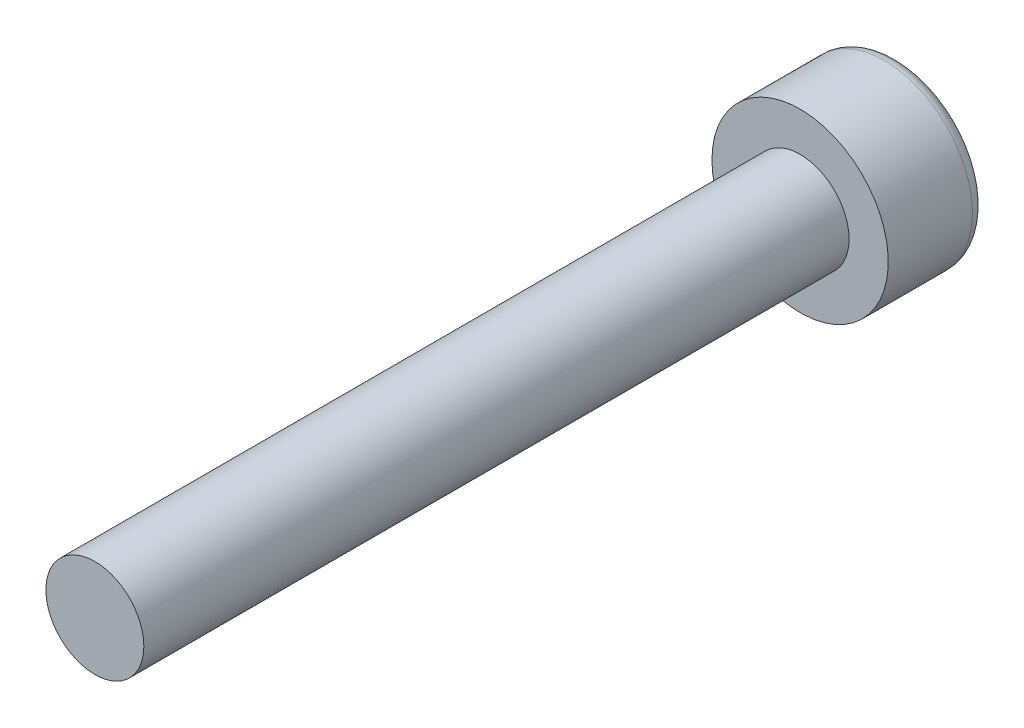
ISO-10303-21;
HEADER;
FILE_DESCRIPTION(('STEP AP214'),'2;1');
FILE_NAME('part.step','',(''),(''),'','','');
FILE_SCHEMA(('AUTOMOTIVE_DESIGN { 1 0 10303 214 1 1 1 1 }'));
ENDSEC;
DATA;
#1=APPLICATION_CONTEXT('core data for automotive mechanical design processes');
#2=APPLICATION_PROTOCOL_DEFINITION('international standard','automotive_design',2000,#1);
#3=PRODUCT_CONTEXT('',#1,'mechanical');
#4=PRODUCT('Part','Part','',(#3));
#5=PRODUCT_RELATED_PRODUCT_CATEGORY('part','',(#4));
#6=PRODUCT_DEFINITION_FORMATION('','',#4);
#7=PRODUCT_DEFINITION_CONTEXT('part definition',#1,'design');
#8=PRODUCT_DEFINITION('design','',#6,#7);
#9=PRODUCT_DEFINITION_SHAPE('','',#8);
#10=(LENGTH_UNIT() NAMED_UNIT(*) SI_UNIT(.MILLI.,.METRE.));
#11=(NAMED_UNIT(*) PLANE_ANGLE_UNIT() SI_UNIT($,.RADIAN.));
#12=(NAMED_UNIT(*) SI_UNIT($,.STERADIAN.) SOLID_ANGLE_UNIT());
#13=UNCERTAINTY_MEASURE_WITH_UNIT(LENGTH_MEASURE(1.E-05),#10,'distance_accuracy_value','');
#14=(GEOMETRIC_REPRESENTATION_CONTEXT(3) GLOBAL_UNCERTAINTY_ASSIGNED_CONTEXT((#13)) GLOBAL_UNIT_ASSIGNED_CONTEXT((#10,
#11,#12)) REPRESENTATION_CONTEXT('',''));
#15=CARTESIAN_POINT('',(0.,0.,0.));
#16=DIRECTION('',(0.,0.,1.));
#17=DIRECTION('',(1.,0.,0.));
#18=AXIS2_PLACEMENT_3D('',#15,#16,#17);
#19=CARTESIAN_POINT('',(0.,0.,18.));
#20=DIRECTION('',(0.,0.,-1.));
#21=DIRECTION('',(-1.,0.,0.));
#22=AXIS2_PLACEMENT_3D('',#19,#20,#21);
#23=CYLINDRICAL_SURFACE('',#22,1.25);
#24=CARTESIAN_POINT('',(0.,0.,18.));
#25=DIRECTION('',(0.,0.,1.));
#26=DIRECTION('',(1.,0.,0.));
#27=AXIS2_PLACEMENT_3D('',#24,#25,#26);
#28=CIRCLE('',#27,1.25);
#29=CARTESIAN_POINT('',(1.25,0.,18.));
#30=VERTEX_POINT('',#29);
#31=EDGE_CURVE('E144',#30,#30,#28,.T.);
#32=ORIENTED_EDGE('',*,*,#31,.F.);
#33=EDGE_LOOP('',(#32));
#34=FACE_BOUND('',#33,.T.);
#35=CARTESIAN_POINT('',(0.,0.,0.));
#36=DIRECTION('',(0.,0.,1.));
#37=DIRECTION('',(1.,0.,0.));
#38=AXIS2_PLACEMENT_3D('',#35,#36,#37);
#39=CIRCLE('',#38,1.25);
#40=CARTESIAN_POINT('',(1.25,0.,0.));
#41=VERTEX_POINT('',#40);
#42=EDGE_CURVE('E143',#41,#41,#39,.T.);
#43=ORIENTED_EDGE('',*,*,#42,.T.);
#44=EDGE_LOOP('',(#43));
#45=FACE_BOUND('',#44,.T.);
#46=ADVANCED_FACE('F33',(#34,#45),#23,.T.);
#47=CARTESIAN_POINT('',(0.,0.,18.));
#48=DIRECTION('',(0.,0.,1.));
#49=DIRECTION('',(1.,0.,0.));
#50=AXIS2_PLACEMENT_3D('',#47,#48,#49);
#51=PLANE('',#50);
#52=ORIENTED_EDGE('',*,*,#31,.T.);
#53=EDGE_LOOP('',(#52));
#54=FACE_BOUND('',#53,.T.);
#55=ADVANCED_FACE('F163',(#54),#51,.T.);
#56=CARTESIAN_POINT('',(0.,0.,-2.5));
#57=DIRECTION('',(0.,0.,1.));
#58=DIRECTION('',(1.,0.,0.));
#59=AXIS2_PLACEMENT_3D('',#56,#57,#58);
#60=CYLINDRICAL_SURFACE('',#59,2.25);
#61=CARTESIAN_POINT('',(0.,0.,-2.15));
#62=DIRECTION('',(0.,0.,-1.));
#63=DIRECTION('',(-1.,0.,0.));
#64=AXIS2_PLACEMENT_3D('',#61,#62,#63);
#65=CIRCLE('',#64,2.25);
#66=CARTESIAN_POINT('',(-2.25,0.,-2.15));
#67=VERTEX_POINT('',#66);
#68=EDGE_CURVE('E11',#67,#67,#65,.F.);
#69=ORIENTED_EDGE('',*,*,#68,.T.);
#70=EDGE_LOOP('',(#69));
#71=FACE_BOUND('',#70,.T.);
#72=CARTESIAN_POINT('',(0.,0.,0.));
#73=DIRECTION('',(0.,0.,-1.));
#74=DIRECTION('',(-1.,0.,0.));
#75=AXIS2_PLACEMENT_3D('',#72,#73,#74);
#76=CIRCLE('',#75,2.25);
#77=CARTESIAN_POINT('',(-2.25,0.,0.));
#78=VERTEX_POINT('',#77);
#79=EDGE_CURVE('E135',#78,#78,#76,.T.);
#80=ORIENTED_EDGE('',*,*,#79,.T.);
#81=EDGE_LOOP('',(#80));
#82=FACE_BOUND('',#81,.T.);
#83=ADVANCED_FACE('F168',(#71,#82),#60,.T.);
#84=CARTESIAN_POINT('',(0.,0.,-2.5));
#85=DIRECTION('',(0.,0.,-1.));
#86=DIRECTION('',(-1.,0.,0.));
#87=AXIS2_PLACEMENT_3D('',#84,#85,#86);
#88=PLANE('',#87);
#89=CARTESIAN_POINT('',(0.,0.,-2.5));
#90=DIRECTION('',(0.,0.,-1.));
#91=DIRECTION('',(-1.,0.,0.));
#92=AXIS2_PLACEMENT_3D('',#89,#90,#91);
#93=CIRCLE('',#92,1.9);
#94=CARTESIAN_POINT('',(-1.9,0.,-2.5));
#95=VERTEX_POINT('',#94);
#96=EDGE_CURVE('E41',#95,#95,#93,.T.);
#97=ORIENTED_EDGE('',*,*,#96,.T.);
#98=EDGE_LOOP('',(#97));
#99=FACE_BOUND('',#98,.T.);
#100=DIRECTION('',(-0.866025403784439,-0.5,0.));
#101=VECTOR('',#100,1.);
#102=CARTESIAN_POINT('',(1.,-0.577350269189626,-2.5));
#103=LINE('',#102,#101);
#104=CARTESIAN_POINT('',(1.,-0.577350269189626,-2.5));
#105=VERTEX_POINT('',#104);
#106=CARTESIAN_POINT('',(0.,-1.15470053837925,-2.5));
#107=VERTEX_POINT('',#106);
#108=EDGE_CURVE('E48',#105,#107,#103,.T.);
#109=ORIENTED_EDGE('',*,*,#108,.F.);
#110=DIRECTION('',(0.,-1.,0.));
#111=VECTOR('',#110,1.);
#112=CARTESIAN_POINT('',(1.,0.577350269189626,-2.5));
#113=LINE('',#112,#111);
#114=CARTESIAN_POINT('',(1.,0.577350269189626,-2.5));
#115=VERTEX_POINT('',#114);
#116=EDGE_CURVE('E131',#115,#105,#113,.T.);
#117=ORIENTED_EDGE('',*,*,#116,.F.);
#118=DIRECTION('',(0.866025403784439,-0.5,0.));
#119=VECTOR('',#118,1.);
#120=CARTESIAN_POINT('',(0.,1.15470053837925,-2.5));
#121=LINE('',#120,#119);
#122=CARTESIAN_POINT('',(0.,1.15470053837925,-2.5));
#123=VERTEX_POINT('',#122);
#124=EDGE_CURVE('E129',#123,#115,#121,.T.);
#125=ORIENTED_EDGE('',*,*,#124,.F.);
#126=DIRECTION('',(0.866025403784439,0.5,0.));
#127=VECTOR('',#126,1.);
#128=CARTESIAN_POINT('',(-1.,0.577350269189626,-2.5));
#129=LINE('',#128,#127);
#130=CARTESIAN_POINT('',(-1.,0.577350269189626,-2.5));
#131=VERTEX_POINT('',#130);
#132=EDGE_CURVE('E96',#131,#123,#129,.T.);
#133=ORIENTED_EDGE('',*,*,#132,.F.);
#134=DIRECTION('',(0.,1.,0.));
#135=VECTOR('',#134,1.);
#136=CARTESIAN_POINT('',(-1.,-0.577350269189626,-2.5));
#137=LINE('',#136,#135);
#138=CARTESIAN_POINT('',(-1.,-0.577350269189626,-2.5));
#139=VERTEX_POINT('',#138);
#140=EDGE_CURVE('E125',#139,#131,#137,.T.);
#141=ORIENTED_EDGE('',*,*,#140,.F.);
#142=DIRECTION('',(-0.866025403784438,0.5,0.));
#143=VECTOR('',#142,1.);
#144=CARTESIAN_POINT('',(0.,-1.15470053837925,-2.5));
#145=LINE('',#144,#143);
#146=EDGE_CURVE('E122',#107,#139,#145,.T.);
#147=ORIENTED_EDGE('',*,*,#146,.F.);
#148=EDGE_LOOP('',(#109,#117,#125,#133,#141,#147));
#149=FACE_BOUND('',#148,.T.);
#150=ADVANCED_FACE('F151',(#99,#149),#88,.T.);
#151=CARTESIAN_POINT('',(0.,0.,0.));
#152=DIRECTION('',(0.,0.,-1.));
#153=DIRECTION('',(-1.,0.,0.));
#154=AXIS2_PLACEMENT_3D('',#151,#152,#153);
#155=PLANE('',#154);
#156=ORIENTED_EDGE('',*,*,#42,.F.);
#157=EDGE_LOOP('',(#156));
#158=FACE_BOUND('',#157,.T.);
#159=ORIENTED_EDGE('',*,*,#79,.F.);
#160=EDGE_LOOP('',(#159));
#161=FACE_BOUND('',#160,.T.);
#162=ADVANCED_FACE('F177',(#158,#161),#155,.F.);
#163=CARTESIAN_POINT('',(1.,-0.577350269189626,-1.));
#164=DIRECTION('',(0.5,-0.866025403784438,0.));
#165=DIRECTION('',(0.866025403784439,0.5,0.));
#166=AXIS2_PLACEMENT_3D('',#163,#164,#165);
#167=PLANE('',#166);
#168=ORIENTED_EDGE('',*,*,#108,.T.);
#169=DIRECTION('',(0.,0.,-1.));
#170=VECTOR('',#169,1.);
#171=CARTESIAN_POINT('',(0.,-1.15470053837925,-1.));
#172=LINE('',#171,#170);
#173=CARTESIAN_POINT('',(0.,-1.15470053837925,-1.));
#174=VERTEX_POINT('',#173);
#175=EDGE_CURVE('E78',#174,#107,#172,.T.);
#176=ORIENTED_EDGE('',*,*,#175,.F.);
#177=DIRECTION('',(-0.866025403784439,-0.5,0.));
#178=VECTOR('',#177,1.);
#179=CARTESIAN_POINT('',(1.,-0.577350269189626,-1.));
#180=LINE('',#179,#178);
#181=CARTESIAN_POINT('',(1.,-0.577350269189626,-1.));
#182=VERTEX_POINT('',#181);
#183=EDGE_CURVE('E133',#182,#174,#180,.T.);
#184=ORIENTED_EDGE('',*,*,#183,.F.);
#185=DIRECTION('',(0.,0.,-1.));
#186=VECTOR('',#185,1.);
#187=CARTESIAN_POINT('',(1.,-0.577350269189626,-1.));
#188=LINE('',#187,#186);
#189=EDGE_CURVE('E56',#182,#105,#188,.T.);
#190=ORIENTED_EDGE('',*,*,#189,.T.);
#191=EDGE_LOOP('',(#168,#176,#184,#190));
#192=FACE_BOUND('',#191,.T.);
#193=ADVANCED_FACE('F180',(#192),#167,.F.);
#194=CARTESIAN_POINT('',(1.,0.577350269189626,-1.));
#195=DIRECTION('',(1.,0.,0.));
#196=DIRECTION('',(0.,1.,0.));
#197=AXIS2_PLACEMENT_3D('',#194,#195,#196);
#198=PLANE('',#197);
#199=ORIENTED_EDGE('',*,*,#116,.T.);
#200=ORIENTED_EDGE('',*,*,#189,.F.);
#201=DIRECTION('',(0.,-1.,0.));
#202=VECTOR('',#201,1.);
#203=CARTESIAN_POINT('',(1.,0.577350269189626,-1.));
#204=LINE('',#203,#202);
#205=CARTESIAN_POINT('',(1.,0.577350269189626,-1.));
#206=VERTEX_POINT('',#205);
#207=EDGE_CURVE('E108',#206,#182,#204,.T.);
#208=ORIENTED_EDGE('',*,*,#207,.F.);
#209=DIRECTION('',(0.,0.,-1.));
#210=VECTOR('',#209,1.);
#211=CARTESIAN_POINT('',(1.,0.577350269189626,-1.));
#212=LINE('',#211,#210);
#213=EDGE_CURVE('E100',#206,#115,#212,.T.);
#214=ORIENTED_EDGE('',*,*,#213,.T.);
#215=EDGE_LOOP('',(#199,#200,#208,#214));
#216=FACE_BOUND('',#215,.T.);
#217=ADVANCED_FACE('F186',(#216),#198,.F.);
#218=CARTESIAN_POINT('',(0.,1.15470053837925,-1.));
#219=DIRECTION('',(0.5,0.866025403784439,0.));
#220=DIRECTION('',(-0.866025403784439,0.5,0.));
#221=AXIS2_PLACEMENT_3D('',#218,#219,#220);
#222=PLANE('',#221);
#223=ORIENTED_EDGE('',*,*,#124,.T.);
#224=ORIENTED_EDGE('',*,*,#213,.F.);
#225=DIRECTION('',(0.866025403784439,-0.5,0.));
#226=VECTOR('',#225,1.);
#227=CARTESIAN_POINT('',(0.,1.15470053837925,-1.));
#228=LINE('',#227,#226);
#229=CARTESIAN_POINT('',(0.,1.15470053837925,-1.));
#230=VERTEX_POINT('',#229);
#231=EDGE_CURVE('E104',#230,#206,#228,.T.);
#232=ORIENTED_EDGE('',*,*,#231,.F.);
#233=DIRECTION('',(0.,0.,-1.));
#234=VECTOR('',#233,1.);
#235=CARTESIAN_POINT('',(0.,1.15470053837925,-1.));
#236=LINE('',#235,#234);
#237=EDGE_CURVE('E89',#230,#123,#236,.T.);
#238=ORIENTED_EDGE('',*,*,#237,.T.);
#239=EDGE_LOOP('',(#223,#224,#232,#238));
#240=FACE_BOUND('',#239,.T.);
#241=ADVANCED_FACE('F105',(#240),#222,.F.);
#242=CARTESIAN_POINT('',(-1.,0.577350269189626,-1.));
#243=DIRECTION('',(-0.5,0.866025403784439,0.));
#244=DIRECTION('',(-0.866025403784439,-0.5,0.));
#245=AXIS2_PLACEMENT_3D('',#242,#243,#244);
#246=PLANE('',#245);
#247=ORIENTED_EDGE('',*,*,#132,.T.);
#248=ORIENTED_EDGE('',*,*,#237,.F.);
#249=DIRECTION('',(0.866025403784439,0.5,0.));
#250=VECTOR('',#249,1.);
#251=CARTESIAN_POINT('',(-1.,0.577350269189626,-1.));
#252=LINE('',#251,#250);
#253=CARTESIAN_POINT('',(-1.,0.577350269189626,-1.));
#254=VERTEX_POINT('',#253);
#255=EDGE_CURVE('E93',#254,#230,#252,.T.);
#256=ORIENTED_EDGE('',*,*,#255,.F.);
#257=DIRECTION('',(0.,0.,-1.));
#258=VECTOR('',#257,1.);
#259=CARTESIAN_POINT('',(-1.,0.577350269189626,-1.));
#260=LINE('',#259,#258);
#261=EDGE_CURVE('E101',#254,#131,#260,.T.);
#262=ORIENTED_EDGE('',*,*,#261,.T.);
#263=EDGE_LOOP('',(#247,#248,#256,#262));
#264=FACE_BOUND('',#263,.T.);
#265=ADVANCED_FACE('F91',(#264),#246,.F.);
#266=CARTESIAN_POINT('',(-1.,-0.577350269189626,-1.));
#267=DIRECTION('',(-1.,0.,0.));
#268=DIRECTION('',(0.,0.,1.));
#269=AXIS2_PLACEMENT_3D('',#266,#267,#268);
#270=PLANE('',#269);
#271=ORIENTED_EDGE('',*,*,#140,.T.);
#272=ORIENTED_EDGE('',*,*,#261,.F.);
#273=DIRECTION('',(0.,1.,0.));
#274=VECTOR('',#273,1.);
#275=CARTESIAN_POINT('',(-1.,-0.577350269189626,-1.));
#276=LINE('',#275,#274);
#277=CARTESIAN_POINT('',(-1.,-0.577350269189626,-1.));
#278=VERTEX_POINT('',#277);
#279=EDGE_CURVE('E114',#278,#254,#276,.T.);
#280=ORIENTED_EDGE('',*,*,#279,.F.);
#281=DIRECTION('',(0.,0.,-1.));
#282=VECTOR('',#281,1.);
#283=CARTESIAN_POINT('',(-1.,-0.577350269189626,-1.));
#284=LINE('',#283,#282);
#285=EDGE_CURVE('E138',#278,#139,#284,.T.);
#286=ORIENTED_EDGE('',*,*,#285,.T.);
#287=EDGE_LOOP('',(#271,#272,#280,#286));
#288=FACE_BOUND('',#287,.T.);
#289=ADVANCED_FACE('F189',(#288),#270,.F.);
#290=CARTESIAN_POINT('',(0.,-1.15470053837925,-1.));
#291=DIRECTION('',(-0.5,-0.866025403784439,0.));
#292=DIRECTION('',(0.866025403784439,-0.5,0.));
#293=AXIS2_PLACEMENT_3D('',#290,#291,#292);
#294=PLANE('',#293);
#295=ORIENTED_EDGE('',*,*,#146,.T.);
#296=ORIENTED_EDGE('',*,*,#285,.F.);
#297=DIRECTION('',(-0.866025403784438,0.5,0.));
#298=VECTOR('',#297,1.);
#299=CARTESIAN_POINT('',(0.,-1.15470053837925,-1.));
#300=LINE('',#299,#298);
#301=EDGE_CURVE('E116',#174,#278,#300,.T.);
#302=ORIENTED_EDGE('',*,*,#301,.F.);
#303=ORIENTED_EDGE('',*,*,#175,.T.);
#304=EDGE_LOOP('',(#295,#296,#302,#303));
#305=FACE_BOUND('',#304,.T.);
#306=ADVANCED_FACE('F159',(#305),#294,.F.);
#307=CARTESIAN_POINT('',(0.,0.,-1.));
#308=DIRECTION('',(0.,0.,-1.));
#309=DIRECTION('',(-1.,0.,0.));
#310=AXIS2_PLACEMENT_3D('',#307,#308,#309);
#311=PLANE('',#310);
#312=ORIENTED_EDGE('',*,*,#183,.T.);
#313=ORIENTED_EDGE('',*,*,#301,.T.);
#314=ORIENTED_EDGE('',*,*,#279,.T.);
#315=ORIENTED_EDGE('',*,*,#255,.T.);
#316=ORIENTED_EDGE('',*,*,#231,.T.);
#317=ORIENTED_EDGE('',*,*,#207,.T.);
#318=EDGE_LOOP('',(#312,#313,#314,#315,#316,#317));
#319=FACE_BOUND('',#318,.T.);
#320=ADVANCED_FACE('F111',(#319),#311,.T.);
#321=CARTESIAN_POINT('',(0.,0.,-2.15));
#322=DIRECTION('',(0.,0.,-1.));
#323=DIRECTION('',(-1.,0.,0.));
#324=AXIS2_PLACEMENT_3D('',#321,#322,#323);
#325=TOROIDAL_SURFACE('',#324,1.9,0.35);
#326=ORIENTED_EDGE('',*,*,#68,.F.);
#327=EDGE_LOOP('',(#326));
#328=FACE_BOUND('',#327,.T.);
#329=ORIENTED_EDGE('',*,*,#96,.F.);
#330=EDGE_LOOP('',(#329));
#331=FACE_BOUND('',#330,.T.);
#332=ADVANCED_FACE('F35',(#328,#331),#325,.T.);
#333=CLOSED_SHELL('',(#46,#55,#83,#150,#162,#193,#217,#241,#265,#289,#306,#320,#332));
#334=MANIFOLD_SOLID_BREP('B2',#333);
#335=ADVANCED_BREP_SHAPE_REPRESENTATION('',(#18,#334),#14);
#336=SHAPE_DEFINITION_REPRESENTATION(#9,#335);
ENDSEC;
END-ISO-10303-21;
